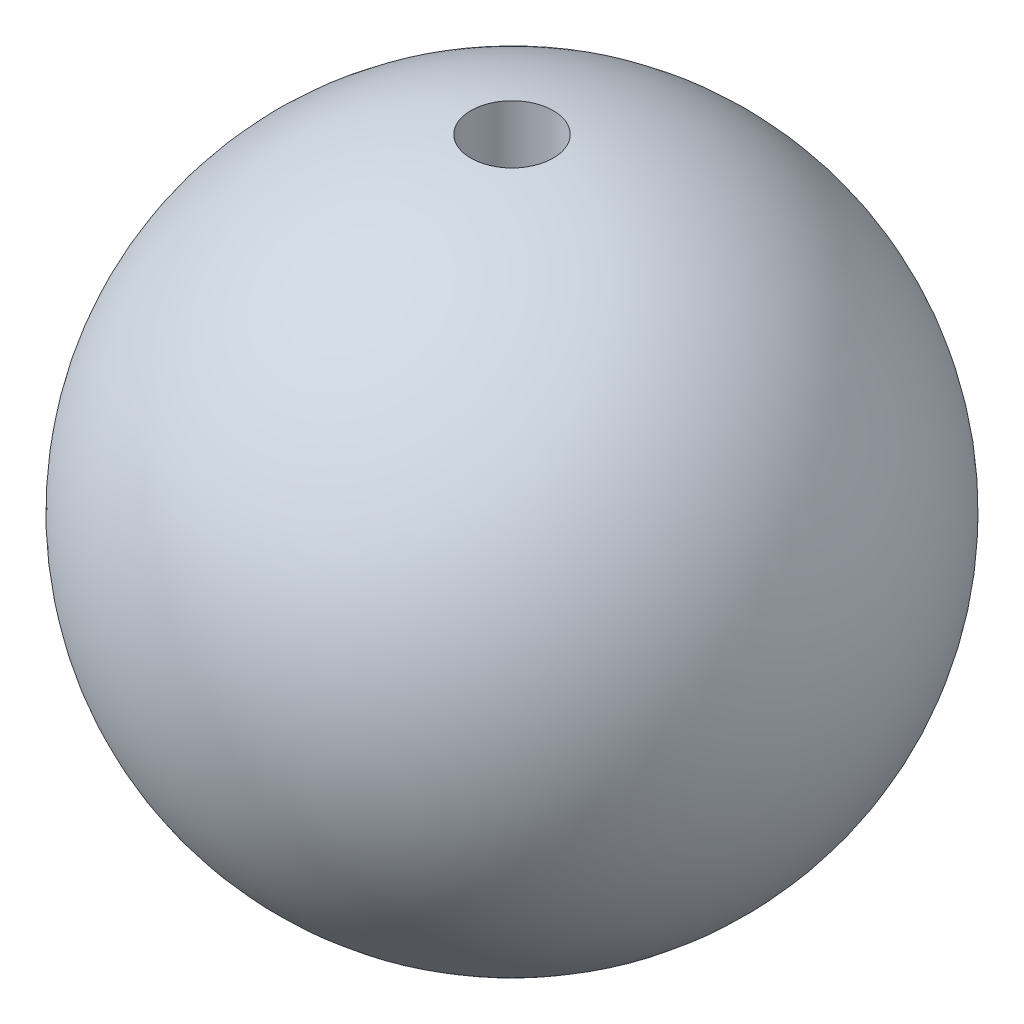
ISO-10303-21;
HEADER;
FILE_DESCRIPTION(('STEP AP214'),'2;1');
FILE_NAME('part.step','',(''),(''),'','','');
FILE_SCHEMA(('AUTOMOTIVE_DESIGN { 1 0 10303 214 1 1 1 1 }'));
ENDSEC;
DATA;
#1=APPLICATION_CONTEXT('core data for automotive mechanical design processes');
#2=APPLICATION_PROTOCOL_DEFINITION('international standard','automotive_design',2000,#1);
#3=PRODUCT_CONTEXT('',#1,'mechanical');
#4=PRODUCT('Part','Part','',(#3));
#5=PRODUCT_RELATED_PRODUCT_CATEGORY('part','',(#4));
#6=PRODUCT_DEFINITION_FORMATION('','',#4);
#7=PRODUCT_DEFINITION_CONTEXT('part definition',#1,'design');
#8=PRODUCT_DEFINITION('design','',#6,#7);
#9=PRODUCT_DEFINITION_SHAPE('','',#8);
#10=(LENGTH_UNIT() NAMED_UNIT(*) SI_UNIT(.MILLI.,.METRE.));
#11=(NAMED_UNIT(*) PLANE_ANGLE_UNIT() SI_UNIT($,.RADIAN.));
#12=(NAMED_UNIT(*) SI_UNIT($,.STERADIAN.) SOLID_ANGLE_UNIT());
#13=UNCERTAINTY_MEASURE_WITH_UNIT(LENGTH_MEASURE(1.E-05),#10,'distance_accuracy_value','');
#14=(GEOMETRIC_REPRESENTATION_CONTEXT(3) GLOBAL_UNCERTAINTY_ASSIGNED_CONTEXT((#13)) GLOBAL_UNIT_ASSIGNED_CONTEXT((#10,
#11,#12)) REPRESENTATION_CONTEXT('',''));
#15=CARTESIAN_POINT('',(0.,0.,0.));
#16=DIRECTION('',(0.,0.,1.));
#17=DIRECTION('',(1.,0.,0.));
#18=AXIS2_PLACEMENT_3D('',#15,#16,#17);
#19=CARTESIAN_POINT('',(0.,0.,0.));
#20=DIRECTION('',(0.,-1.,0.));
#21=DIRECTION('',(-1.,0.,0.));
#22=AXIS2_PLACEMENT_3D('',#19,#20,#21);
#23=SPHERICAL_SURFACE('',#22,12.7);
#24=CARTESIAN_POINT('',(0.,12.6003906189451,0.));
#25=DIRECTION('',(0.,-1.,0.));
#26=DIRECTION('',(0.,0.,-1.));
#27=AXIS2_PLACEMENT_3D('',#24,#25,#26);
#28=CIRCLE('',#27,1.5875);
#29=CARTESIAN_POINT('',(0.,12.6003906189451,-1.5875));
#30=VERTEX_POINT('',#29);
#31=EDGE_CURVE('E10',#30,#30,#28,.T.);
#32=ORIENTED_EDGE('',*,*,#31,.T.);
#33=EDGE_LOOP('',(#32));
#34=FACE_BOUND('',#33,.T.);
#35=ADVANCED_FACE('F32',(#34),#23,.T.);
#36=CARTESIAN_POINT('',(0.,12.7,0.));
#37=DIRECTION('',(0.,-1.,0.));
#38=DIRECTION('',(0.,0.,-1.));
#39=AXIS2_PLACEMENT_3D('',#36,#37,#38);
#40=CYLINDRICAL_SURFACE('',#39,1.5875);
#41=ORIENTED_EDGE('',*,*,#31,.F.);
#42=EDGE_LOOP('',(#41));
#43=FACE_BOUND('',#42,.T.);
#44=CARTESIAN_POINT('',(0.,0.,0.));
#45=DIRECTION('',(0.,1.,0.));
#46=DIRECTION('',(0.,0.,1.));
#47=AXIS2_PLACEMENT_3D('',#44,#45,#46);
#48=CIRCLE('',#47,1.5875);
#49=CARTESIAN_POINT('',(0.,0.,1.5875));
#50=VERTEX_POINT('',#49);
#51=EDGE_CURVE('E38',#50,#50,#48,.T.);
#52=ORIENTED_EDGE('',*,*,#51,.F.);
#53=EDGE_LOOP('',(#52));
#54=FACE_BOUND('',#53,.T.);
#55=ADVANCED_FACE('F46',(#43,#54),#40,.F.);
#56=CARTESIAN_POINT('',(0.,0.,0.));
#57=DIRECTION('',(0.,1.,0.));
#58=DIRECTION('',(0.,0.,1.));
#59=AXIS2_PLACEMENT_3D('',#56,#57,#58);
#60=PLANE('',#59);
#61=ORIENTED_EDGE('',*,*,#51,.T.);
#62=EDGE_LOOP('',(#61));
#63=FACE_BOUND('',#62,.T.);
#64=ADVANCED_FACE('F44',(#63),#60,.T.);
#65=CLOSED_SHELL('',(#35,#55,#64));
#66=MANIFOLD_SOLID_BREP('B2',#65);
#67=ADVANCED_BREP_SHAPE_REPRESENTATION('',(#18,#66),#14);
#68=SHAPE_DEFINITION_REPRESENTATION(#9,#67);
ENDSEC;
END-ISO-10303-21;
